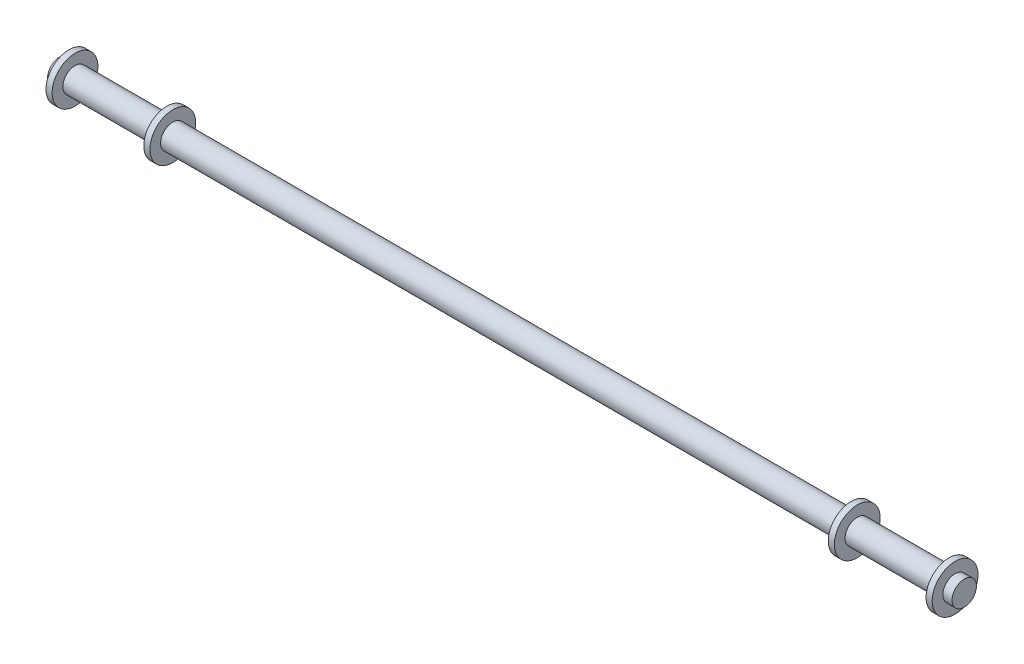
ISO-10303-21;
HEADER;
FILE_DESCRIPTION(('STEP AP214'),'2;1');
FILE_NAME('part.step','',(''),(''),'','','');
FILE_SCHEMA(('AUTOMOTIVE_DESIGN { 1 0 10303 214 1 1 1 1 }'));
ENDSEC;
DATA;
#1=APPLICATION_CONTEXT('core data for automotive mechanical design processes');
#2=APPLICATION_PROTOCOL_DEFINITION('international standard','automotive_design',2000,#1);
#3=PRODUCT_CONTEXT('',#1,'mechanical');
#4=PRODUCT('Part','Part','',(#3));
#5=PRODUCT_RELATED_PRODUCT_CATEGORY('part','',(#4));
#6=PRODUCT_DEFINITION_FORMATION('','',#4);
#7=PRODUCT_DEFINITION_CONTEXT('part definition',#1,'design');
#8=PRODUCT_DEFINITION('design','',#6,#7);
#9=PRODUCT_DEFINITION_SHAPE('','',#8);
#10=(LENGTH_UNIT() NAMED_UNIT(*) SI_UNIT(.MILLI.,.METRE.));
#11=(NAMED_UNIT(*) PLANE_ANGLE_UNIT() SI_UNIT($,.RADIAN.));
#12=(NAMED_UNIT(*) SI_UNIT($,.STERADIAN.) SOLID_ANGLE_UNIT());
#13=UNCERTAINTY_MEASURE_WITH_UNIT(LENGTH_MEASURE(1.E-05),#10,'distance_accuracy_value','');
#14=(GEOMETRIC_REPRESENTATION_CONTEXT(3) GLOBAL_UNCERTAINTY_ASSIGNED_CONTEXT((#13)) GLOBAL_UNIT_ASSIGNED_CONTEXT((#10,
#11,#12)) REPRESENTATION_CONTEXT('',''));
#15=CARTESIAN_POINT('',(0.,0.,0.));
#16=DIRECTION('',(0.,0.,1.));
#17=DIRECTION('',(1.,0.,0.));
#18=AXIS2_PLACEMENT_3D('',#15,#16,#17);
#19=CARTESIAN_POINT('',(375.92,0.,0.));
#20=DIRECTION('',(-1.,0.,0.));
#21=DIRECTION('',(0.,0.,1.));
#22=AXIS2_PLACEMENT_3D('',#19,#20,#21);
#23=CYLINDRICAL_SURFACE('',#22,10.16);
#24=CARTESIAN_POINT('',(-281.94,0.,0.));
#25=DIRECTION('',(-1.,0.,0.));
#26=DIRECTION('',(0.,0.,1.));
#27=AXIS2_PLACEMENT_3D('',#24,#25,#26);
#28=CIRCLE('',#27,10.16);
#29=CARTESIAN_POINT('',(-281.94,0.,10.16));
#30=VERTEX_POINT('',#29);
#31=EDGE_CURVE('E46',#30,#30,#28,.T.);
#32=ORIENTED_EDGE('',*,*,#31,.F.);
#33=EDGE_LOOP('',(#32));
#34=FACE_BOUND('',#33,.T.);
#35=CARTESIAN_POINT('',(281.94,0.,0.));
#36=DIRECTION('',(1.,0.,0.));
#37=DIRECTION('',(0.,0.,-1.));
#38=AXIS2_PLACEMENT_3D('',#35,#36,#37);
#39=CIRCLE('',#38,10.16);
#40=CARTESIAN_POINT('',(281.94,0.,-10.16));
#41=VERTEX_POINT('',#40);
#42=EDGE_CURVE('E10',#41,#41,#39,.T.);
#43=ORIENTED_EDGE('',*,*,#42,.F.);
#44=EDGE_LOOP('',(#43));
#45=FACE_BOUND('',#44,.T.);
#46=ADVANCED_FACE('F35',(#34,#45),#23,.T.);
#47=CARTESIAN_POINT('',(-368.3,0.,0.));
#48=DIRECTION('',(-1.,0.,0.));
#49=DIRECTION('',(0.,0.,1.));
#50=AXIS2_PLACEMENT_3D('',#47,#48,#49);
#51=CIRCLE('',#50,10.16);
#52=CARTESIAN_POINT('',(-368.3,0.,10.16));
#53=VERTEX_POINT('',#52);
#54=EDGE_CURVE('E86',#53,#53,#51,.T.);
#55=ORIENTED_EDGE('',*,*,#54,.T.);
#56=EDGE_LOOP('',(#55));
#57=FACE_BOUND('',#56,.T.);
#58=CARTESIAN_POINT('',(-375.92,0.,0.));
#59=DIRECTION('',(1.,0.,0.));
#60=DIRECTION('',(0.,0.,-1.));
#61=AXIS2_PLACEMENT_3D('',#58,#59,#60);
#62=CIRCLE('',#61,10.16);
#63=CARTESIAN_POINT('',(-375.92,0.,-10.16));
#64=VERTEX_POINT('',#63);
#65=EDGE_CURVE('E93',#64,#64,#62,.T.);
#66=ORIENTED_EDGE('',*,*,#65,.T.);
#67=EDGE_LOOP('',(#66));
#68=FACE_BOUND('',#67,.T.);
#69=ADVANCED_FACE('F37',(#57,#68),#23,.T.);
#70=CARTESIAN_POINT('',(-375.92,0.,0.));
#71=DIRECTION('',(1.,0.,0.));
#72=DIRECTION('',(0.,0.,-1.));
#73=AXIS2_PLACEMENT_3D('',#70,#71,#72);
#74=PLANE('',#73);
#75=ORIENTED_EDGE('',*,*,#65,.F.);
#76=EDGE_LOOP('',(#75));
#77=FACE_BOUND('',#76,.T.);
#78=ADVANCED_FACE('F135',(#77),#74,.F.);
#79=CARTESIAN_POINT('',(-368.3,0.,0.));
#80=DIRECTION('',(1.,0.,0.));
#81=DIRECTION('',(0.,0.,-1.));
#82=AXIS2_PLACEMENT_3D('',#79,#80,#81);
#83=CYLINDRICAL_SURFACE('',#82,19.05);
#84=CARTESIAN_POINT('',(-368.3,0.,0.));
#85=DIRECTION('',(-1.,0.,0.));
#86=DIRECTION('',(0.,0.,1.));
#87=AXIS2_PLACEMENT_3D('',#84,#85,#86);
#88=CIRCLE('',#87,19.05);
#89=CARTESIAN_POINT('',(-368.3,0.,19.05));
#90=VERTEX_POINT('',#89);
#91=EDGE_CURVE('E83',#90,#90,#88,.T.);
#92=ORIENTED_EDGE('',*,*,#91,.F.);
#93=EDGE_LOOP('',(#92));
#94=FACE_BOUND('',#93,.T.);
#95=CARTESIAN_POINT('',(-363.22,0.,0.));
#96=DIRECTION('',(-1.,0.,0.));
#97=DIRECTION('',(0.,0.,1.));
#98=AXIS2_PLACEMENT_3D('',#95,#96,#97);
#99=CIRCLE('',#98,19.05);
#100=CARTESIAN_POINT('',(-363.22,0.,19.05));
#101=VERTEX_POINT('',#100);
#102=EDGE_CURVE('E87',#101,#101,#99,.T.);
#103=ORIENTED_EDGE('',*,*,#102,.T.);
#104=EDGE_LOOP('',(#103));
#105=FACE_BOUND('',#104,.T.);
#106=ADVANCED_FACE('F221',(#94,#105),#83,.T.);
#107=CARTESIAN_POINT('',(-368.3,0.,0.));
#108=DIRECTION('',(-1.,0.,0.));
#109=DIRECTION('',(0.,0.,1.));
#110=AXIS2_PLACEMENT_3D('',#107,#108,#109);
#111=PLANE('',#110);
#112=ORIENTED_EDGE('',*,*,#54,.F.);
#113=EDGE_LOOP('',(#112));
#114=FACE_BOUND('',#113,.T.);
#115=ORIENTED_EDGE('',*,*,#91,.T.);
#116=EDGE_LOOP('',(#115));
#117=FACE_BOUND('',#116,.T.);
#118=ADVANCED_FACE('F225',(#114,#117),#111,.T.);
#119=CARTESIAN_POINT('',(-363.22,0.,0.));
#120=DIRECTION('',(-1.,0.,0.));
#121=DIRECTION('',(0.,0.,1.));
#122=AXIS2_PLACEMENT_3D('',#119,#120,#121);
#123=PLANE('',#122);
#124=CARTESIAN_POINT('',(-363.22,0.,0.));
#125=DIRECTION('',(-1.,0.,0.));
#126=DIRECTION('',(0.,0.,1.));
#127=AXIS2_PLACEMENT_3D('',#124,#125,#126);
#128=CIRCLE('',#127,10.16);
#129=CARTESIAN_POINT('',(-363.22,0.,10.16));
#130=VERTEX_POINT('',#129);
#131=EDGE_CURVE('E51',#130,#130,#128,.T.);
#132=ORIENTED_EDGE('',*,*,#131,.T.);
#133=EDGE_LOOP('',(#132));
#134=FACE_BOUND('',#133,.T.);
#135=ORIENTED_EDGE('',*,*,#102,.F.);
#136=EDGE_LOOP('',(#135));
#137=FACE_BOUND('',#136,.T.);
#138=ADVANCED_FACE('F124',(#134,#137),#123,.F.);
#139=CARTESIAN_POINT('',(-287.02,0.,0.));
#140=DIRECTION('',(-1.,0.,0.));
#141=DIRECTION('',(0.,0.,1.));
#142=AXIS2_PLACEMENT_3D('',#139,#140,#141);
#143=CIRCLE('',#142,10.16);
#144=CARTESIAN_POINT('',(-287.02,0.,10.16));
#145=VERTEX_POINT('',#144);
#146=EDGE_CURVE('E80',#145,#145,#143,.T.);
#147=ORIENTED_EDGE('',*,*,#146,.T.);
#148=EDGE_LOOP('',(#147));
#149=FACE_BOUND('',#148,.T.);
#150=ORIENTED_EDGE('',*,*,#131,.F.);
#151=EDGE_LOOP('',(#150));
#152=FACE_BOUND('',#151,.T.);
#153=ADVANCED_FACE('F102',(#149,#152),#23,.T.);
#154=CARTESIAN_POINT('',(-281.94,0.,0.));
#155=DIRECTION('',(-1.,0.,0.));
#156=DIRECTION('',(0.,0.,1.));
#157=AXIS2_PLACEMENT_3D('',#154,#155,#156);
#158=CYLINDRICAL_SURFACE('',#157,19.05);
#159=CARTESIAN_POINT('',(-281.94,0.,0.));
#160=DIRECTION('',(-1.,0.,0.));
#161=DIRECTION('',(0.,0.,1.));
#162=AXIS2_PLACEMENT_3D('',#159,#160,#161);
#163=CIRCLE('',#162,19.05);
#164=CARTESIAN_POINT('',(-281.94,0.,19.05));
#165=VERTEX_POINT('',#164);
#166=EDGE_CURVE('E77',#165,#165,#163,.T.);
#167=ORIENTED_EDGE('',*,*,#166,.T.);
#168=EDGE_LOOP('',(#167));
#169=FACE_BOUND('',#168,.T.);
#170=CARTESIAN_POINT('',(-287.02,0.,0.));
#171=DIRECTION('',(-1.,0.,0.));
#172=DIRECTION('',(0.,0.,1.));
#173=AXIS2_PLACEMENT_3D('',#170,#171,#172);
#174=CIRCLE('',#173,19.05);
#175=CARTESIAN_POINT('',(-287.02,0.,19.05));
#176=VERTEX_POINT('',#175);
#177=EDGE_CURVE('E57',#176,#176,#174,.T.);
#178=ORIENTED_EDGE('',*,*,#177,.F.);
#179=EDGE_LOOP('',(#178));
#180=FACE_BOUND('',#179,.T.);
#181=ADVANCED_FACE('F113',(#169,#180),#158,.T.);
#182=CARTESIAN_POINT('',(-281.94,0.,0.));
#183=DIRECTION('',(-1.,0.,0.));
#184=DIRECTION('',(0.,0.,1.));
#185=AXIS2_PLACEMENT_3D('',#182,#183,#184);
#186=PLANE('',#185);
#187=ORIENTED_EDGE('',*,*,#31,.T.);
#188=EDGE_LOOP('',(#187));
#189=FACE_BOUND('',#188,.T.);
#190=ORIENTED_EDGE('',*,*,#166,.F.);
#191=EDGE_LOOP('',(#190));
#192=FACE_BOUND('',#191,.T.);
#193=ADVANCED_FACE('F109',(#189,#192),#186,.F.);
#194=CARTESIAN_POINT('',(-287.02,0.,0.));
#195=DIRECTION('',(-1.,0.,0.));
#196=DIRECTION('',(0.,0.,1.));
#197=AXIS2_PLACEMENT_3D('',#194,#195,#196);
#198=PLANE('',#197);
#199=ORIENTED_EDGE('',*,*,#146,.F.);
#200=EDGE_LOOP('',(#199));
#201=FACE_BOUND('',#200,.T.);
#202=ORIENTED_EDGE('',*,*,#177,.T.);
#203=EDGE_LOOP('',(#202));
#204=FACE_BOUND('',#203,.T.);
#205=ADVANCED_FACE('F105',(#201,#204),#198,.T.);
#206=CARTESIAN_POINT('',(281.94,0.,0.));
#207=DIRECTION('',(1.,0.,0.));
#208=DIRECTION('',(0.,0.,-1.));
#209=AXIS2_PLACEMENT_3D('',#206,#207,#208);
#210=CYLINDRICAL_SURFACE('',#209,19.05);
#211=CARTESIAN_POINT('',(281.94,0.,0.));
#212=DIRECTION('',(1.,0.,0.));
#213=DIRECTION('',(0.,0.,-1.));
#214=AXIS2_PLACEMENT_3D('',#211,#212,#213);
#215=CIRCLE('',#214,19.05);
#216=CARTESIAN_POINT('',(281.94,0.,-19.05));
#217=VERTEX_POINT('',#216);
#218=EDGE_CURVE('E62',#217,#217,#215,.T.);
#219=ORIENTED_EDGE('',*,*,#218,.T.);
#220=EDGE_LOOP('',(#219));
#221=FACE_BOUND('',#220,.T.);
#222=CARTESIAN_POINT('',(287.02,0.,0.));
#223=DIRECTION('',(1.,0.,0.));
#224=DIRECTION('',(0.,0.,-1.));
#225=AXIS2_PLACEMENT_3D('',#222,#223,#224);
#226=CIRCLE('',#225,19.05);
#227=CARTESIAN_POINT('',(287.02,0.,-19.05));
#228=VERTEX_POINT('',#227);
#229=EDGE_CURVE('E68',#228,#228,#226,.T.);
#230=ORIENTED_EDGE('',*,*,#229,.F.);
#231=EDGE_LOOP('',(#230));
#232=FACE_BOUND('',#231,.T.);
#233=ADVANCED_FACE('F108',(#221,#232),#210,.T.);
#234=CARTESIAN_POINT('',(281.94,0.,0.));
#235=DIRECTION('',(1.,0.,0.));
#236=DIRECTION('',(0.,0.,-1.));
#237=AXIS2_PLACEMENT_3D('',#234,#235,#236);
#238=PLANE('',#237);
#239=ORIENTED_EDGE('',*,*,#42,.T.);
#240=EDGE_LOOP('',(#239));
#241=FACE_BOUND('',#240,.T.);
#242=ORIENTED_EDGE('',*,*,#218,.F.);
#243=EDGE_LOOP('',(#242));
#244=FACE_BOUND('',#243,.T.);
#245=ADVANCED_FACE('F177',(#241,#244),#238,.F.);
#246=CARTESIAN_POINT('',(287.02,0.,0.));
#247=DIRECTION('',(1.,0.,0.));
#248=DIRECTION('',(0.,0.,-1.));
#249=AXIS2_PLACEMENT_3D('',#246,#247,#248);
#250=PLANE('',#249);
#251=CARTESIAN_POINT('',(287.02,0.,0.));
#252=DIRECTION('',(1.,0.,0.));
#253=DIRECTION('',(0.,0.,-1.));
#254=AXIS2_PLACEMENT_3D('',#251,#252,#253);
#255=CIRCLE('',#254,10.16);
#256=CARTESIAN_POINT('',(287.02,0.,-10.16));
#257=VERTEX_POINT('',#256);
#258=EDGE_CURVE('E59',#257,#257,#255,.T.);
#259=ORIENTED_EDGE('',*,*,#258,.F.);
#260=EDGE_LOOP('',(#259));
#261=FACE_BOUND('',#260,.T.);
#262=ORIENTED_EDGE('',*,*,#229,.T.);
#263=EDGE_LOOP('',(#262));
#264=FACE_BOUND('',#263,.T.);
#265=ADVANCED_FACE('F158',(#261,#264),#250,.T.);
#266=CARTESIAN_POINT('',(375.92,0.,0.));
#267=DIRECTION('',(1.,0.,0.));
#268=DIRECTION('',(0.,0.,-1.));
#269=AXIS2_PLACEMENT_3D('',#266,#267,#268);
#270=PLANE('',#269);
#271=CARTESIAN_POINT('',(375.92,0.,0.));
#272=DIRECTION('',(1.,0.,0.));
#273=DIRECTION('',(0.,0.,-1.));
#274=AXIS2_PLACEMENT_3D('',#271,#272,#273);
#275=CIRCLE('',#274,10.16);
#276=CARTESIAN_POINT('',(375.92,0.,-10.16));
#277=VERTEX_POINT('',#276);
#278=EDGE_CURVE('E90',#277,#277,#275,.T.);
#279=ORIENTED_EDGE('',*,*,#278,.T.);
#280=EDGE_LOOP('',(#279));
#281=FACE_BOUND('',#280,.T.);
#282=ADVANCED_FACE('F149',(#281),#270,.T.);
#283=CARTESIAN_POINT('',(368.3,0.,0.));
#284=DIRECTION('',(1.,0.,0.));
#285=DIRECTION('',(0.,0.,-1.));
#286=AXIS2_PLACEMENT_3D('',#283,#284,#285);
#287=CIRCLE('',#286,10.16);
#288=CARTESIAN_POINT('',(368.3,0.,-10.16));
#289=VERTEX_POINT('',#288);
#290=EDGE_CURVE('E55',#289,#289,#287,.T.);
#291=ORIENTED_EDGE('',*,*,#290,.T.);
#292=EDGE_LOOP('',(#291));
#293=FACE_BOUND('',#292,.T.);
#294=ORIENTED_EDGE('',*,*,#278,.F.);
#295=EDGE_LOOP('',(#294));
#296=FACE_BOUND('',#295,.T.);
#297=ADVANCED_FACE('F125',(#293,#296),#23,.T.);
#298=CARTESIAN_POINT('',(368.3,0.,0.));
#299=DIRECTION('',(1.,0.,0.));
#300=DIRECTION('',(0.,0.,-1.));
#301=AXIS2_PLACEMENT_3D('',#298,#299,#300);
#302=PLANE('',#301);
#303=ORIENTED_EDGE('',*,*,#290,.F.);
#304=EDGE_LOOP('',(#303));
#305=FACE_BOUND('',#304,.T.);
#306=CARTESIAN_POINT('',(368.3,0.,0.));
#307=DIRECTION('',(1.,0.,0.));
#308=DIRECTION('',(0.,0.,-1.));
#309=AXIS2_PLACEMENT_3D('',#306,#307,#308);
#310=CIRCLE('',#309,19.05);
#311=CARTESIAN_POINT('',(368.3,0.,-19.05));
#312=VERTEX_POINT('',#311);
#313=EDGE_CURVE('E58',#312,#312,#310,.T.);
#314=ORIENTED_EDGE('',*,*,#313,.T.);
#315=EDGE_LOOP('',(#314));
#316=FACE_BOUND('',#315,.T.);
#317=ADVANCED_FACE('F148',(#305,#316),#302,.T.);
#318=CARTESIAN_POINT('',(368.3,0.,0.));
#319=DIRECTION('',(-1.,0.,0.));
#320=DIRECTION('',(0.,0.,1.));
#321=AXIS2_PLACEMENT_3D('',#318,#319,#320);
#322=CYLINDRICAL_SURFACE('',#321,19.05);
#323=ORIENTED_EDGE('',*,*,#313,.F.);
#324=EDGE_LOOP('',(#323));
#325=FACE_BOUND('',#324,.T.);
#326=CARTESIAN_POINT('',(363.22,0.,0.));
#327=DIRECTION('',(1.,0.,0.));
#328=DIRECTION('',(0.,0.,-1.));
#329=AXIS2_PLACEMENT_3D('',#326,#327,#328);
#330=CIRCLE('',#329,19.05);
#331=CARTESIAN_POINT('',(363.22,0.,-19.05));
#332=VERTEX_POINT('',#331);
#333=EDGE_CURVE('E61',#332,#332,#330,.T.);
#334=ORIENTED_EDGE('',*,*,#333,.T.);
#335=EDGE_LOOP('',(#334));
#336=FACE_BOUND('',#335,.T.);
#337=ADVANCED_FACE('F145',(#325,#336),#322,.T.);
#338=CARTESIAN_POINT('',(363.22,0.,0.));
#339=DIRECTION('',(1.,0.,0.));
#340=DIRECTION('',(0.,0.,-1.));
#341=AXIS2_PLACEMENT_3D('',#338,#339,#340);
#342=PLANE('',#341);
#343=CARTESIAN_POINT('',(363.22,0.,0.));
#344=DIRECTION('',(1.,0.,0.));
#345=DIRECTION('',(0.,0.,-1.));
#346=AXIS2_PLACEMENT_3D('',#343,#344,#345);
#347=CIRCLE('',#346,10.16);
#348=CARTESIAN_POINT('',(363.22,0.,-10.16));
#349=VERTEX_POINT('',#348);
#350=EDGE_CURVE('E42',#349,#349,#347,.T.);
#351=ORIENTED_EDGE('',*,*,#350,.T.);
#352=EDGE_LOOP('',(#351));
#353=FACE_BOUND('',#352,.T.);
#354=ORIENTED_EDGE('',*,*,#333,.F.);
#355=EDGE_LOOP('',(#354));
#356=FACE_BOUND('',#355,.T.);
#357=ADVANCED_FACE('F140',(#353,#356),#342,.F.);
#358=ORIENTED_EDGE('',*,*,#258,.T.);
#359=EDGE_LOOP('',(#358));
#360=FACE_BOUND('',#359,.T.);
#361=ORIENTED_EDGE('',*,*,#350,.F.);
#362=EDGE_LOOP('',(#361));
#363=FACE_BOUND('',#362,.T.);
#364=ADVANCED_FACE('F129',(#360,#363),#23,.T.);
#365=CLOSED_SHELL('',(#46,#69,#78,#106,#118,#138,#153,#181,#193,#205,#233,#245,#265,#282,#297,
#317,#337,#357,#364));
#366=MANIFOLD_SOLID_BREP('B2',#365);
#367=ADVANCED_BREP_SHAPE_REPRESENTATION('',(#18,#366),#14);
#368=SHAPE_DEFINITION_REPRESENTATION(#9,#367);
ENDSEC;
END-ISO-10303-21;
